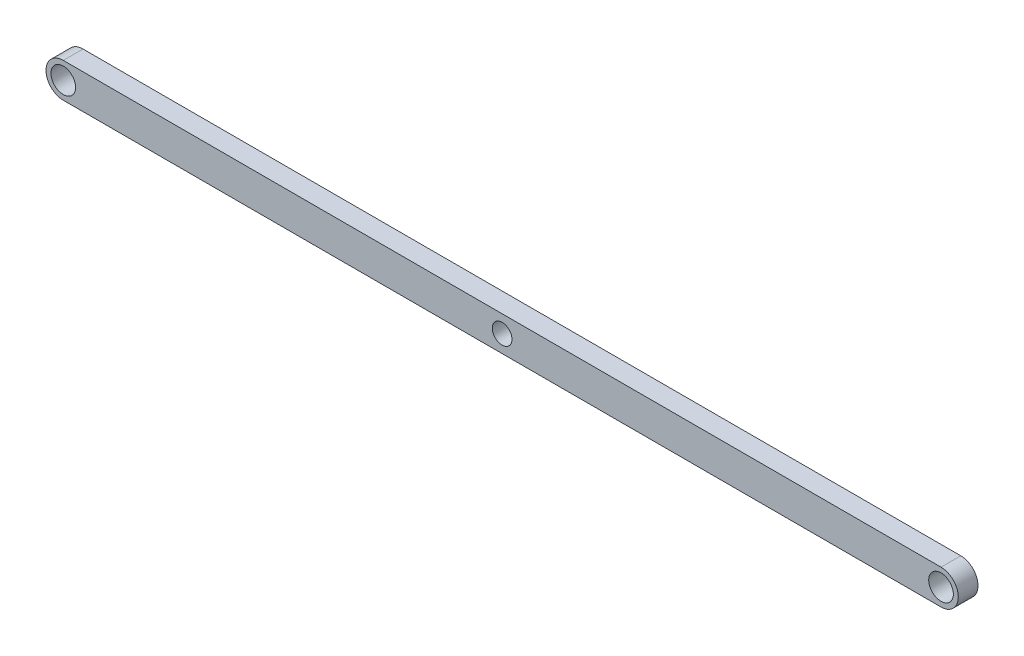
ISO-10303-21;
HEADER;
FILE_DESCRIPTION(('STEP AP214'),'2;1');
FILE_NAME('part.step','',(''),(''),'','','');
FILE_SCHEMA(('AUTOMOTIVE_DESIGN { 1 0 10303 214 1 1 1 1 }'));
ENDSEC;
DATA;
#1=APPLICATION_CONTEXT('core data for automotive mechanical design processes');
#2=APPLICATION_PROTOCOL_DEFINITION('international standard','automotive_design',2000,#1);
#3=PRODUCT_CONTEXT('',#1,'mechanical');
#4=PRODUCT('Part','Part','',(#3));
#5=PRODUCT_RELATED_PRODUCT_CATEGORY('part','',(#4));
#6=PRODUCT_DEFINITION_FORMATION('','',#4);
#7=PRODUCT_DEFINITION_CONTEXT('part definition',#1,'design');
#8=PRODUCT_DEFINITION('design','',#6,#7);
#9=PRODUCT_DEFINITION_SHAPE('','',#8);
#10=(LENGTH_UNIT() NAMED_UNIT(*) SI_UNIT(.MILLI.,.METRE.));
#11=(NAMED_UNIT(*) PLANE_ANGLE_UNIT() SI_UNIT($,.RADIAN.));
#12=(NAMED_UNIT(*) SI_UNIT($,.STERADIAN.) SOLID_ANGLE_UNIT());
#13=UNCERTAINTY_MEASURE_WITH_UNIT(LENGTH_MEASURE(1.E-05),#10,'distance_accuracy_value','');
#14=(GEOMETRIC_REPRESENTATION_CONTEXT(3) GLOBAL_UNCERTAINTY_ASSIGNED_CONTEXT((#13)) GLOBAL_UNIT_ASSIGNED_CONTEXT((#10,
#11,#12)) REPRESENTATION_CONTEXT('',''));
#15=CARTESIAN_POINT('',(0.,0.,0.));
#16=DIRECTION('',(0.,0.,1.));
#17=DIRECTION('',(1.,0.,0.));
#18=AXIS2_PLACEMENT_3D('',#15,#16,#17);
#19=CARTESIAN_POINT('',(-92.2615501062117,19.7290649407362,4.));
#20=DIRECTION('',(0.,0.,1.));
#21=DIRECTION('',(1.,0.,0.));
#22=AXIS2_PLACEMENT_3D('',#19,#20,#21);
#23=PLANE('',#22);
#24=CARTESIAN_POINT('',(-92.2615501062117,19.7290649407362,4.));
#25=DIRECTION('',(0.,0.,1.));
#26=DIRECTION('',(1.,0.,0.));
#27=AXIS2_PLACEMENT_3D('',#24,#25,#26);
#28=CIRCLE('',#27,2.49999999999999);
#29=CARTESIAN_POINT('',(-89.7615501062117,19.7290649407362,4.));
#30=VERTEX_POINT('',#29);
#31=EDGE_CURVE('E115',#30,#30,#28,.T.);
#32=ORIENTED_EDGE('',*,*,#31,.F.);
#33=EDGE_LOOP('',(#32));
#34=FACE_BOUND('',#33,.T.);
#35=CARTESIAN_POINT('',(-92.2615501062117,19.7290649407362,4.));
#36=DIRECTION('',(0.,0.,1.));
#37=DIRECTION('',(1.,0.,0.));
#38=AXIS2_PLACEMENT_3D('',#35,#36,#37);
#39=CIRCLE('',#38,3.5);
#40=CARTESIAN_POINT('',(-92.2615501062117,23.2290649407362,4.));
#41=VERTEX_POINT('',#40);
#42=CARTESIAN_POINT('',(-92.2615501062117,16.2290649407362,4.));
#43=VERTEX_POINT('',#42);
#44=EDGE_CURVE('E85',#41,#43,#39,.T.);
#45=ORIENTED_EDGE('',*,*,#44,.T.);
#46=DIRECTION('',(1.,0.,0.));
#47=VECTOR('',#46,1.);
#48=CARTESIAN_POINT('',(85.7384498937883,16.2290649407362,4.));
#49=LINE('',#48,#47);
#50=CARTESIAN_POINT('',(85.7384498937883,16.2290649407362,4.));
#51=VERTEX_POINT('',#50);
#52=EDGE_CURVE('E80',#43,#51,#49,.T.);
#53=ORIENTED_EDGE('',*,*,#52,.T.);
#54=CARTESIAN_POINT('',(85.7384498937883,19.7290649407362,4.));
#55=DIRECTION('',(0.,0.,1.));
#56=DIRECTION('',(-1.,0.,0.));
#57=AXIS2_PLACEMENT_3D('',#54,#55,#56);
#58=CIRCLE('',#57,3.50000000000001);
#59=CARTESIAN_POINT('',(85.7384498937883,23.2290649407362,4.));
#60=VERTEX_POINT('',#59);
#61=EDGE_CURVE('E83',#51,#60,#58,.T.);
#62=ORIENTED_EDGE('',*,*,#61,.T.);
#63=DIRECTION('',(-1.,0.,0.));
#64=VECTOR('',#63,1.);
#65=CARTESIAN_POINT('',(-92.2615501062117,23.2290649407362,4.));
#66=LINE('',#65,#64);
#67=EDGE_CURVE('E50',#60,#41,#66,.T.);
#68=ORIENTED_EDGE('',*,*,#67,.T.);
#69=EDGE_LOOP('',(#45,#53,#62,#68));
#70=FACE_BOUND('',#69,.T.);
#71=CARTESIAN_POINT('',(-3.26155010621174,19.7290649407362,4.));
#72=DIRECTION('',(0.,0.,1.));
#73=DIRECTION('',(1.,0.,0.));
#74=AXIS2_PLACEMENT_3D('',#71,#72,#73);
#75=CIRCLE('',#74,2.);
#76=CARTESIAN_POINT('',(-1.26155010621173,19.7290649407362,4.));
#77=VERTEX_POINT('',#76);
#78=EDGE_CURVE('E100',#77,#77,#75,.T.);
#79=ORIENTED_EDGE('',*,*,#78,.F.);
#80=EDGE_LOOP('',(#79));
#81=FACE_BOUND('',#80,.T.);
#82=CARTESIAN_POINT('',(85.7384498937883,19.7290649407362,4.));
#83=DIRECTION('',(0.,0.,1.));
#84=DIRECTION('',(1.,0.,0.));
#85=AXIS2_PLACEMENT_3D('',#82,#83,#84);
#86=CIRCLE('',#85,2.49999999999999);
#87=CARTESIAN_POINT('',(88.2384498937882,19.7290649407362,4.));
#88=VERTEX_POINT('',#87);
#89=EDGE_CURVE('E121',#88,#88,#86,.T.);
#90=ORIENTED_EDGE('',*,*,#89,.F.);
#91=EDGE_LOOP('',(#90));
#92=FACE_BOUND('',#91,.T.);
#93=ADVANCED_FACE('F33',(#34,#70,#81,#92),#23,.T.);
#94=CARTESIAN_POINT('',(-92.2615501062117,19.7290649407362,0.));
#95=DIRECTION('',(0.,0.,1.));
#96=DIRECTION('',(1.,0.,0.));
#97=AXIS2_PLACEMENT_3D('',#94,#95,#96);
#98=PLANE('',#97);
#99=CARTESIAN_POINT('',(-92.2615501062117,19.7290649407362,0.));
#100=DIRECTION('',(0.,0.,1.));
#101=DIRECTION('',(1.,0.,0.));
#102=AXIS2_PLACEMENT_3D('',#99,#100,#101);
#103=CIRCLE('',#102,3.5);
#104=CARTESIAN_POINT('',(-92.2615501062117,23.2290649407362,0.));
#105=VERTEX_POINT('',#104);
#106=CARTESIAN_POINT('',(-92.2615501062117,16.2290649407362,0.));
#107=VERTEX_POINT('',#106);
#108=EDGE_CURVE('E97',#105,#107,#103,.T.);
#109=ORIENTED_EDGE('',*,*,#108,.F.);
#110=DIRECTION('',(-1.,0.,0.));
#111=VECTOR('',#110,1.);
#112=CARTESIAN_POINT('',(-92.2615501062117,23.2290649407362,0.));
#113=LINE('',#112,#111);
#114=CARTESIAN_POINT('',(85.7384498937883,23.2290649407362,0.));
#115=VERTEX_POINT('',#114);
#116=EDGE_CURVE('E73',#115,#105,#113,.T.);
#117=ORIENTED_EDGE('',*,*,#116,.F.);
#118=CARTESIAN_POINT('',(85.7384498937883,19.7290649407362,0.));
#119=DIRECTION('',(0.,0.,1.));
#120=DIRECTION('',(-1.,0.,0.));
#121=AXIS2_PLACEMENT_3D('',#118,#119,#120);
#122=CIRCLE('',#121,3.50000000000001);
#123=CARTESIAN_POINT('',(85.7384498937883,16.2290649407362,0.));
#124=VERTEX_POINT('',#123);
#125=EDGE_CURVE('E67',#124,#115,#122,.T.);
#126=ORIENTED_EDGE('',*,*,#125,.F.);
#127=DIRECTION('',(1.,0.,0.));
#128=VECTOR('',#127,1.);
#129=CARTESIAN_POINT('',(85.7384498937883,16.2290649407362,0.));
#130=LINE('',#129,#128);
#131=EDGE_CURVE('E89',#107,#124,#130,.T.);
#132=ORIENTED_EDGE('',*,*,#131,.F.);
#133=EDGE_LOOP('',(#109,#117,#126,#132));
#134=FACE_BOUND('',#133,.T.);
#135=CARTESIAN_POINT('',(-3.26155010621174,19.7290649407362,0.));
#136=DIRECTION('',(0.,0.,1.));
#137=DIRECTION('',(1.,0.,0.));
#138=AXIS2_PLACEMENT_3D('',#135,#136,#137);
#139=CIRCLE('',#138,2.);
#140=CARTESIAN_POINT('',(-1.26155010621173,19.7290649407362,0.));
#141=VERTEX_POINT('',#140);
#142=EDGE_CURVE('E112',#141,#141,#139,.T.);
#143=ORIENTED_EDGE('',*,*,#142,.T.);
#144=EDGE_LOOP('',(#143));
#145=FACE_BOUND('',#144,.T.);
#146=CARTESIAN_POINT('',(-92.2615501062117,19.7290649407362,0.));
#147=DIRECTION('',(0.,0.,1.));
#148=DIRECTION('',(1.,0.,0.));
#149=AXIS2_PLACEMENT_3D('',#146,#147,#148);
#150=CIRCLE('',#149,2.49999999999999);
#151=CARTESIAN_POINT('',(-89.7615501062117,19.7290649407362,0.));
#152=VERTEX_POINT('',#151);
#153=EDGE_CURVE('E118',#152,#152,#150,.T.);
#154=ORIENTED_EDGE('',*,*,#153,.T.);
#155=EDGE_LOOP('',(#154));
#156=FACE_BOUND('',#155,.T.);
#157=CARTESIAN_POINT('',(85.7384498937883,19.7290649407362,0.));
#158=DIRECTION('',(0.,0.,1.));
#159=DIRECTION('',(1.,0.,0.));
#160=AXIS2_PLACEMENT_3D('',#157,#158,#159);
#161=CIRCLE('',#160,2.49999999999999);
#162=CARTESIAN_POINT('',(88.2384498937882,19.7290649407362,0.));
#163=VERTEX_POINT('',#162);
#164=EDGE_CURVE('E124',#163,#163,#161,.T.);
#165=ORIENTED_EDGE('',*,*,#164,.T.);
#166=EDGE_LOOP('',(#165));
#167=FACE_BOUND('',#166,.T.);
#168=ADVANCED_FACE('F108',(#134,#145,#156,#167),#98,.F.);
#169=CARTESIAN_POINT('',(-92.2615501062117,19.7290649407362,4.));
#170=DIRECTION('',(0.,0.,-1.));
#171=DIRECTION('',(-1.,0.,0.));
#172=AXIS2_PLACEMENT_3D('',#169,#170,#171);
#173=CYLINDRICAL_SURFACE('',#172,3.5);
#174=ORIENTED_EDGE('',*,*,#108,.T.);
#175=DIRECTION('',(0.,0.,-1.));
#176=VECTOR('',#175,1.);
#177=CARTESIAN_POINT('',(-92.2615501062117,16.2290649407362,4.));
#178=LINE('',#177,#176);
#179=EDGE_CURVE('E11',#43,#107,#178,.T.);
#180=ORIENTED_EDGE('',*,*,#179,.F.);
#181=ORIENTED_EDGE('',*,*,#44,.F.);
#182=DIRECTION('',(0.,0.,-1.));
#183=VECTOR('',#182,1.);
#184=CARTESIAN_POINT('',(-92.2615501062117,23.2290649407362,4.));
#185=LINE('',#184,#183);
#186=EDGE_CURVE('E93',#41,#105,#185,.T.);
#187=ORIENTED_EDGE('',*,*,#186,.T.);
#188=EDGE_LOOP('',(#174,#180,#181,#187));
#189=FACE_BOUND('',#188,.T.);
#190=ADVANCED_FACE('F35',(#189),#173,.T.);
#191=CARTESIAN_POINT('',(85.7384498937883,16.2290649407362,4.));
#192=DIRECTION('',(0.,1.,0.));
#193=DIRECTION('',(-1.,0.,0.));
#194=AXIS2_PLACEMENT_3D('',#191,#192,#193);
#195=PLANE('',#194);
#196=ORIENTED_EDGE('',*,*,#131,.T.);
#197=DIRECTION('',(0.,0.,-1.));
#198=VECTOR('',#197,1.);
#199=CARTESIAN_POINT('',(85.7384498937883,16.2290649407362,4.));
#200=LINE('',#199,#198);
#201=EDGE_CURVE('E42',#51,#124,#200,.T.);
#202=ORIENTED_EDGE('',*,*,#201,.F.);
#203=ORIENTED_EDGE('',*,*,#52,.F.);
#204=ORIENTED_EDGE('',*,*,#179,.T.);
#205=EDGE_LOOP('',(#196,#202,#203,#204));
#206=FACE_BOUND('',#205,.T.);
#207=ADVANCED_FACE('F88',(#206),#195,.F.);
#208=CARTESIAN_POINT('',(85.7384498937883,19.7290649407362,4.));
#209=DIRECTION('',(0.,0.,-1.));
#210=DIRECTION('',(-1.,0.,0.));
#211=AXIS2_PLACEMENT_3D('',#208,#209,#210);
#212=CYLINDRICAL_SURFACE('',#211,3.50000000000001);
#213=ORIENTED_EDGE('',*,*,#125,.T.);
#214=DIRECTION('',(0.,0.,-1.));
#215=VECTOR('',#214,1.);
#216=CARTESIAN_POINT('',(85.7384498937883,23.2290649407362,4.));
#217=LINE('',#216,#215);
#218=EDGE_CURVE('E90',#60,#115,#217,.T.);
#219=ORIENTED_EDGE('',*,*,#218,.F.);
#220=ORIENTED_EDGE('',*,*,#61,.F.);
#221=ORIENTED_EDGE('',*,*,#201,.T.);
#222=EDGE_LOOP('',(#213,#219,#220,#221));
#223=FACE_BOUND('',#222,.T.);
#224=ADVANCED_FACE('F91',(#223),#212,.T.);
#225=CARTESIAN_POINT('',(-92.2615501062117,23.2290649407362,4.));
#226=DIRECTION('',(0.,-1.,0.));
#227=DIRECTION('',(1.,0.,0.));
#228=AXIS2_PLACEMENT_3D('',#225,#226,#227);
#229=PLANE('',#228);
#230=ORIENTED_EDGE('',*,*,#116,.T.);
#231=ORIENTED_EDGE('',*,*,#186,.F.);
#232=ORIENTED_EDGE('',*,*,#67,.F.);
#233=ORIENTED_EDGE('',*,*,#218,.T.);
#234=EDGE_LOOP('',(#230,#231,#232,#233));
#235=FACE_BOUND('',#234,.T.);
#236=ADVANCED_FACE('F105',(#235),#229,.F.);
#237=CARTESIAN_POINT('',(-3.26155010621174,19.7290649407362,4.));
#238=DIRECTION('',(0.,0.,-1.));
#239=DIRECTION('',(-1.,0.,0.));
#240=AXIS2_PLACEMENT_3D('',#237,#238,#239);
#241=CYLINDRICAL_SURFACE('',#240,2.);
#242=ORIENTED_EDGE('',*,*,#78,.T.);
#243=EDGE_LOOP('',(#242));
#244=FACE_BOUND('',#243,.T.);
#245=ORIENTED_EDGE('',*,*,#142,.F.);
#246=EDGE_LOOP('',(#245));
#247=FACE_BOUND('',#246,.T.);
#248=ADVANCED_FACE('F142',(#244,#247),#241,.F.);
#249=CARTESIAN_POINT('',(-92.2615501062117,19.7290649407362,4.));
#250=DIRECTION('',(0.,0.,-1.));
#251=DIRECTION('',(-1.,0.,0.));
#252=AXIS2_PLACEMENT_3D('',#249,#250,#251);
#253=CYLINDRICAL_SURFACE('',#252,2.49999999999999);
#254=ORIENTED_EDGE('',*,*,#31,.T.);
#255=EDGE_LOOP('',(#254));
#256=FACE_BOUND('',#255,.T.);
#257=ORIENTED_EDGE('',*,*,#153,.F.);
#258=EDGE_LOOP('',(#257));
#259=FACE_BOUND('',#258,.T.);
#260=ADVANCED_FACE('F188',(#256,#259),#253,.F.);
#261=CARTESIAN_POINT('',(85.7384498937883,19.7290649407362,4.));
#262=DIRECTION('',(0.,0.,-1.));
#263=DIRECTION('',(-1.,0.,0.));
#264=AXIS2_PLACEMENT_3D('',#261,#262,#263);
#265=CYLINDRICAL_SURFACE('',#264,2.49999999999999);
#266=ORIENTED_EDGE('',*,*,#89,.T.);
#267=EDGE_LOOP('',(#266));
#268=FACE_BOUND('',#267,.T.);
#269=ORIENTED_EDGE('',*,*,#164,.F.);
#270=EDGE_LOOP('',(#269));
#271=FACE_BOUND('',#270,.T.);
#272=ADVANCED_FACE('F130',(#268,#271),#265,.F.);
#273=CLOSED_SHELL('',(#93,#168,#190,#207,#224,#236,#248,#260,#272));
#274=MANIFOLD_SOLID_BREP('B2',#273);
#275=ADVANCED_BREP_SHAPE_REPRESENTATION('',(#18,#274),#14);
#276=SHAPE_DEFINITION_REPRESENTATION(#9,#275);
ENDSEC;
END-ISO-10303-21;
